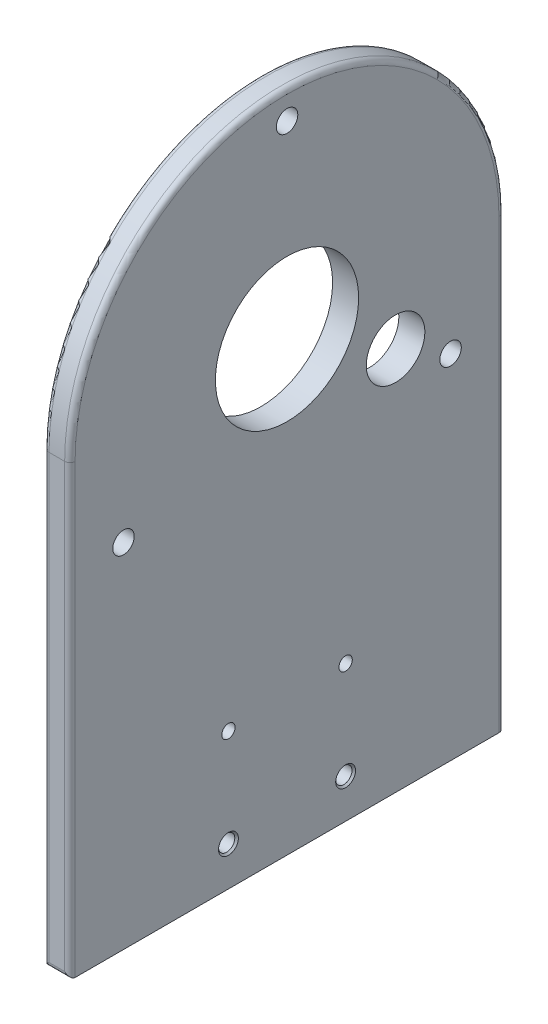
ISO-10303-21;
HEADER;
FILE_DESCRIPTION(('STEP AP214'),'2;1');
FILE_NAME('part.step','',(''),(''),'','','');
FILE_SCHEMA(('AUTOMOTIVE_DESIGN { 1 0 10303 214 1 1 1 1 }'));
ENDSEC;
DATA;
#1=APPLICATION_CONTEXT('core data for automotive mechanical design processes');
#2=APPLICATION_PROTOCOL_DEFINITION('international standard','automotive_design',2000,#1);
#3=PRODUCT_CONTEXT('',#1,'mechanical');
#4=PRODUCT('Part','Part','',(#3));
#5=PRODUCT_RELATED_PRODUCT_CATEGORY('part','',(#4));
#6=PRODUCT_DEFINITION_FORMATION('','',#4);
#7=PRODUCT_DEFINITION_CONTEXT('part definition',#1,'design');
#8=PRODUCT_DEFINITION('design','',#6,#7);
#9=PRODUCT_DEFINITION_SHAPE('','',#8);
#10=(LENGTH_UNIT() NAMED_UNIT(*) SI_UNIT(.MILLI.,.METRE.));
#11=(NAMED_UNIT(*) PLANE_ANGLE_UNIT() SI_UNIT($,.RADIAN.));
#12=(NAMED_UNIT(*) SI_UNIT($,.STERADIAN.) SOLID_ANGLE_UNIT());
#13=UNCERTAINTY_MEASURE_WITH_UNIT(LENGTH_MEASURE(1.E-05),#10,'distance_accuracy_value','');
#14=(GEOMETRIC_REPRESENTATION_CONTEXT(3) GLOBAL_UNCERTAINTY_ASSIGNED_CONTEXT((#13)) GLOBAL_UNIT_ASSIGNED_CONTEXT((#10,
#11,#12)) REPRESENTATION_CONTEXT('',''));
#15=CARTESIAN_POINT('',(0.,0.,0.));
#16=DIRECTION('',(0.,0.,1.));
#17=DIRECTION('',(1.,0.,0.));
#18=AXIS2_PLACEMENT_3D('',#15,#16,#17);
#19=CARTESIAN_POINT('',(-20.,2.,-33.35));
#20=DIRECTION('',(0.,0.,1.));
#21=DIRECTION('',(1.,0.,0.));
#22=AXIS2_PLACEMENT_3D('',#19,#20,#21);
#23=PLANE('',#22);
#24=DIRECTION('',(-1.,0.,0.));
#25=VECTOR('',#24,1.);
#26=CARTESIAN_POINT('',(20.,68.65,-33.35));
#27=LINE('',#26,#25);
#28=CARTESIAN_POINT('',(-16.8,68.65,-33.35));
#29=VERTEX_POINT('',#28);
#30=CARTESIAN_POINT('',(-19.2,68.65,-33.35));
#31=VERTEX_POINT('',#30);
#32=EDGE_CURVE('E161',#29,#31,#27,.T.);
#33=ORIENTED_EDGE('',*,*,#32,.F.);
#34=DIRECTION('',(0.,-1.,0.));
#35=VECTOR('',#34,1.);
#36=CARTESIAN_POINT('',(-16.8,2.,-33.35));
#37=LINE('',#36,#35);
#38=CARTESIAN_POINT('',(-16.8,0.,-33.35));
#39=VERTEX_POINT('',#38);
#40=EDGE_CURVE('E146',#29,#39,#37,.T.);
#41=ORIENTED_EDGE('',*,*,#40,.T.);
#42=DIRECTION('',(-1.,0.,0.));
#43=VECTOR('',#42,1.);
#44=CARTESIAN_POINT('',(-20.,0.,-33.35));
#45=LINE('',#44,#43);
#46=CARTESIAN_POINT('',(-19.2,0.,-33.35));
#47=VERTEX_POINT('',#46);
#48=EDGE_CURVE('E158',#39,#47,#45,.T.);
#49=ORIENTED_EDGE('',*,*,#48,.T.);
#50=DIRECTION('',(0.,-1.,0.));
#51=VECTOR('',#50,1.);
#52=CARTESIAN_POINT('',(-19.2,2.,-33.35));
#53=LINE('',#52,#51);
#54=EDGE_CURVE('E164',#47,#31,#53,.F.);
#55=ORIENTED_EDGE('',*,*,#54,.T.);
#56=EDGE_LOOP('',(#33,#41,#49,#55));
#57=FACE_BOUND('',#56,.T.);
#58=ADVANCED_FACE('F77',(#57),#23,.F.);
#59=CARTESIAN_POINT('',(-20.,2.,33.35));
#60=DIRECTION('',(1.,0.,0.));
#61=DIRECTION('',(0.,0.,-1.));
#62=AXIS2_PLACEMENT_3D('',#59,#60,#61);
#63=PLANE('',#62);
#64=CARTESIAN_POINT('',(-20.,21.,9.));
#65=DIRECTION('',(-1.,0.,0.));
#66=DIRECTION('',(0.,0.,1.));
#67=AXIS2_PLACEMENT_3D('',#64,#65,#66);
#68=CIRCLE('',#67,1.275);
#69=CARTESIAN_POINT('',(-20.,21.,10.275));
#70=VERTEX_POINT('',#69);
#71=EDGE_CURVE('E227',#70,#70,#68,.T.);
#72=ORIENTED_EDGE('',*,*,#71,.F.);
#73=EDGE_LOOP('',(#72));
#74=FACE_BOUND('',#73,.T.);
#75=CARTESIAN_POINT('',(-20.,21.,-9.));
#76=DIRECTION('',(-1.,0.,0.));
#77=DIRECTION('',(0.,0.,1.));
#78=AXIS2_PLACEMENT_3D('',#75,#76,#77);
#79=CIRCLE('',#78,1.275);
#80=CARTESIAN_POINT('',(-20.,21.,-7.725));
#81=VERTEX_POINT('',#80);
#82=EDGE_CURVE('E243',#81,#81,#79,.T.);
#83=ORIENTED_EDGE('',*,*,#82,.F.);
#84=EDGE_LOOP('',(#83));
#85=FACE_BOUND('',#84,.T.);
#86=CARTESIAN_POINT('',(-20.,59.0250000000002,-16.6709890228505));
#87=DIRECTION('',(1.,0.,0.));
#88=DIRECTION('',(0.,0.,-1.));
#89=AXIS2_PLACEMENT_3D('',#86,#87,#88);
#90=CIRCLE('',#89,4.49999999999999);
#91=CARTESIAN_POINT('',(-20.,59.0250000000002,-21.1709890228505));
#92=VERTEX_POINT('',#91);
#93=EDGE_CURVE('E272',#92,#92,#90,.F.);
#94=ORIENTED_EDGE('',*,*,#93,.F.);
#95=EDGE_LOOP('',(#94));
#96=FACE_BOUND('',#95,.T.);
#97=CARTESIAN_POINT('',(-20.,68.65,0.));
#98=DIRECTION('',(1.,0.,0.));
#99=DIRECTION('',(0.,0.,-1.));
#100=AXIS2_PLACEMENT_3D('',#97,#98,#99);
#101=CIRCLE('',#100,11.);
#102=CARTESIAN_POINT('',(-20.,68.65,-11.));
#103=VERTEX_POINT('',#102);
#104=EDGE_CURVE('E281',#103,#103,#101,.F.);
#105=ORIENTED_EDGE('',*,*,#104,.F.);
#106=EDGE_LOOP('',(#105));
#107=FACE_BOUND('',#106,.T.);
#108=CARTESIAN_POINT('',(-20.,97.65,0.));
#109=DIRECTION('',(-1.,0.,0.));
#110=DIRECTION('',(0.,0.,1.));
#111=AXIS2_PLACEMENT_3D('',#108,#109,#110);
#112=CIRCLE('',#111,2.025);
#113=CARTESIAN_POINT('',(-20.,97.65,2.025));
#114=VERTEX_POINT('',#113);
#115=EDGE_CURVE('E284',#114,#114,#112,.T.);
#116=ORIENTED_EDGE('',*,*,#115,.F.);
#117=EDGE_LOOP('',(#116));
#118=FACE_BOUND('',#117,.T.);
#119=CARTESIAN_POINT('',(-20.,54.1499999999999,25.1147367097487));
#120=DIRECTION('',(-1.,0.,0.));
#121=DIRECTION('',(0.,0.,1.));
#122=AXIS2_PLACEMENT_3D('',#119,#120,#121);
#123=CIRCLE('',#122,2.025);
#124=CARTESIAN_POINT('',(-20.,54.1499999999999,27.1397367097487));
#125=VERTEX_POINT('',#124);
#126=EDGE_CURVE('E190',#125,#125,#123,.T.);
#127=ORIENTED_EDGE('',*,*,#126,.F.);
#128=EDGE_LOOP('',(#127));
#129=FACE_BOUND('',#128,.T.);
#130=CARTESIAN_POINT('',(-20.,54.1500000000002,-25.1147367097489));
#131=DIRECTION('',(-1.,0.,0.));
#132=DIRECTION('',(0.,0.,1.));
#133=AXIS2_PLACEMENT_3D('',#130,#131,#132);
#134=CIRCLE('',#133,2.025);
#135=CARTESIAN_POINT('',(-20.,54.1500000000002,-23.0897367097489));
#136=VERTEX_POINT('',#135);
#137=EDGE_CURVE('E185',#136,#136,#134,.T.);
#138=ORIENTED_EDGE('',*,*,#137,.F.);
#139=EDGE_LOOP('',(#138));
#140=FACE_BOUND('',#139,.T.);
#141=CARTESIAN_POINT('',(-20.,68.65,0.));
#142=DIRECTION('',(1.,0.,0.));
#143=DIRECTION('',(0.,0.,-1.));
#144=AXIS2_PLACEMENT_3D('',#141,#142,#143);
#145=CIRCLE('',#144,32.55);
#146=CARTESIAN_POINT('',(-20.,68.65,32.55));
#147=VERTEX_POINT('',#146);
#148=CARTESIAN_POINT('',(-20.,68.65,-32.55));
#149=VERTEX_POINT('',#148);
#150=EDGE_CURVE('E205',#147,#149,#145,.F.);
#151=ORIENTED_EDGE('',*,*,#150,.T.);
#152=DIRECTION('',(0.,-1.,0.));
#153=VECTOR('',#152,1.);
#154=CARTESIAN_POINT('',(-20.,2.,-32.55));
#155=LINE('',#154,#153);
#156=CARTESIAN_POINT('',(-20.,0.,-32.55));
#157=VERTEX_POINT('',#156);
#158=EDGE_CURVE('E207',#149,#157,#155,.T.);
#159=ORIENTED_EDGE('',*,*,#158,.T.);
#160=DIRECTION('',(0.,0.,1.));
#161=VECTOR('',#160,1.);
#162=CARTESIAN_POINT('',(-20.,0.,33.35));
#163=LINE('',#162,#161);
#164=CARTESIAN_POINT('',(-20.,0.,32.55));
#165=VERTEX_POINT('',#164);
#166=EDGE_CURVE('E169',#157,#165,#163,.T.);
#167=ORIENTED_EDGE('',*,*,#166,.T.);
#168=DIRECTION('',(0.,-1.,0.));
#169=VECTOR('',#168,1.);
#170=CARTESIAN_POINT('',(-20.,2.,32.55));
#171=LINE('',#170,#169);
#172=EDGE_CURVE('E203',#165,#147,#171,.F.);
#173=ORIENTED_EDGE('',*,*,#172,.T.);
#174=EDGE_LOOP('',(#151,#159,#167,#173));
#175=FACE_BOUND('',#174,.T.);
#176=CARTESIAN_POINT('',(-20.,6.,9.));
#177=DIRECTION('',(1.,0.,0.));
#178=DIRECTION('',(0.,0.,-1.));
#179=AXIS2_PLACEMENT_3D('',#176,#177,#178);
#180=CIRCLE('',#179,1.24999999999999);
#181=CARTESIAN_POINT('',(-20.,6.,7.75000000000001));
#182=VERTEX_POINT('',#181);
#183=EDGE_CURVE('E258',#182,#182,#180,.T.);
#184=ORIENTED_EDGE('',*,*,#183,.T.);
#185=EDGE_LOOP('',(#184));
#186=FACE_BOUND('',#185,.T.);
#187=CARTESIAN_POINT('',(-20.,6.,-9.));
#188=DIRECTION('',(1.,0.,0.));
#189=DIRECTION('',(0.,0.,-1.));
#190=AXIS2_PLACEMENT_3D('',#187,#188,#189);
#191=CIRCLE('',#190,1.24999999999999);
#192=CARTESIAN_POINT('',(-20.,6.,-10.25));
#193=VERTEX_POINT('',#192);
#194=EDGE_CURVE('E267',#193,#193,#191,.T.);
#195=ORIENTED_EDGE('',*,*,#194,.T.);
#196=EDGE_LOOP('',(#195));
#197=FACE_BOUND('',#196,.T.);
#198=ADVANCED_FACE('F307',(#74,#85,#96,#107,#118,#129,#140,#175,#186,#197),#63,.F.);
#199=CARTESIAN_POINT('',(-16.,102.,-33.35));
#200=DIRECTION('',(-1.,0.,0.));
#201=DIRECTION('',(0.,0.,1.));
#202=AXIS2_PLACEMENT_3D('',#199,#200,#201);
#203=PLANE('',#202);
#204=CARTESIAN_POINT('',(-16.,21.,9.));
#205=DIRECTION('',(-1.,0.,0.));
#206=DIRECTION('',(0.,0.,1.));
#207=AXIS2_PLACEMENT_3D('',#204,#205,#206);
#208=CIRCLE('',#207,1.025);
#209=CARTESIAN_POINT('',(-16.,21.,10.025));
#210=VERTEX_POINT('',#209);
#211=EDGE_CURVE('E238',#210,#210,#208,.T.);
#212=ORIENTED_EDGE('',*,*,#211,.T.);
#213=EDGE_LOOP('',(#212));
#214=FACE_BOUND('',#213,.T.);
#215=CARTESIAN_POINT('',(-16.,21.,-9.));
#216=DIRECTION('',(-1.,0.,0.));
#217=DIRECTION('',(0.,0.,1.));
#218=AXIS2_PLACEMENT_3D('',#215,#216,#217);
#219=CIRCLE('',#218,1.025);
#220=CARTESIAN_POINT('',(-16.,21.,-7.975));
#221=VERTEX_POINT('',#220);
#222=EDGE_CURVE('E249',#221,#221,#219,.T.);
#223=ORIENTED_EDGE('',*,*,#222,.T.);
#224=EDGE_LOOP('',(#223));
#225=FACE_BOUND('',#224,.T.);
#226=CARTESIAN_POINT('',(-16.,6.,9.));
#227=DIRECTION('',(1.,0.,0.));
#228=DIRECTION('',(0.,0.,-1.));
#229=AXIS2_PLACEMENT_3D('',#226,#227,#228);
#230=CIRCLE('',#229,1.525);
#231=CARTESIAN_POINT('',(-16.,6.,7.475));
#232=VERTEX_POINT('',#231);
#233=EDGE_CURVE('E252',#232,#232,#230,.T.);
#234=ORIENTED_EDGE('',*,*,#233,.F.);
#235=EDGE_LOOP('',(#234));
#236=FACE_BOUND('',#235,.T.);
#237=CARTESIAN_POINT('',(-16.,6.,-9.));
#238=DIRECTION('',(1.,0.,0.));
#239=DIRECTION('',(0.,0.,-1.));
#240=AXIS2_PLACEMENT_3D('',#237,#238,#239);
#241=CIRCLE('',#240,1.525);
#242=CARTESIAN_POINT('',(-16.,6.,-10.525));
#243=VERTEX_POINT('',#242);
#244=EDGE_CURVE('E261',#243,#243,#241,.T.);
#245=ORIENTED_EDGE('',*,*,#244,.F.);
#246=EDGE_LOOP('',(#245));
#247=FACE_BOUND('',#246,.T.);
#248=CARTESIAN_POINT('',(-16.,59.0250000000002,-16.6709890228505));
#249=DIRECTION('',(1.,0.,0.));
#250=DIRECTION('',(0.,0.,-1.));
#251=AXIS2_PLACEMENT_3D('',#248,#249,#250);
#252=CIRCLE('',#251,4.49999999999999);
#253=CARTESIAN_POINT('',(-16.,59.0250000000002,-21.1709890228505));
#254=VERTEX_POINT('',#253);
#255=EDGE_CURVE('E275',#254,#254,#252,.T.);
#256=ORIENTED_EDGE('',*,*,#255,.F.);
#257=EDGE_LOOP('',(#256));
#258=FACE_BOUND('',#257,.T.);
#259=CARTESIAN_POINT('',(-16.,68.65,0.));
#260=DIRECTION('',(1.,0.,0.));
#261=DIRECTION('',(0.,0.,-1.));
#262=AXIS2_PLACEMENT_3D('',#259,#260,#261);
#263=CIRCLE('',#262,11.);
#264=CARTESIAN_POINT('',(-16.,68.65,-11.));
#265=VERTEX_POINT('',#264);
#266=EDGE_CURVE('E278',#265,#265,#263,.T.);
#267=ORIENTED_EDGE('',*,*,#266,.F.);
#268=EDGE_LOOP('',(#267));
#269=FACE_BOUND('',#268,.T.);
#270=CARTESIAN_POINT('',(-16.,97.65,0.));
#271=DIRECTION('',(-1.,0.,0.));
#272=DIRECTION('',(0.,0.,1.));
#273=AXIS2_PLACEMENT_3D('',#270,#271,#272);
#274=CIRCLE('',#273,1.64999999999998);
#275=CARTESIAN_POINT('',(-16.,97.65,1.64999999999998));
#276=VERTEX_POINT('',#275);
#277=EDGE_CURVE('E187',#276,#276,#274,.T.);
#278=ORIENTED_EDGE('',*,*,#277,.T.);
#279=EDGE_LOOP('',(#278));
#280=FACE_BOUND('',#279,.T.);
#281=CARTESIAN_POINT('',(-16.,54.1499999999999,25.1147367097487));
#282=DIRECTION('',(-1.,0.,0.));
#283=DIRECTION('',(0.,0.,1.));
#284=AXIS2_PLACEMENT_3D('',#281,#282,#283);
#285=CIRCLE('',#284,1.64999999999999);
#286=CARTESIAN_POINT('',(-16.,54.1499999999999,26.7647367097487));
#287=VERTEX_POINT('',#286);
#288=EDGE_CURVE('E182',#287,#287,#285,.T.);
#289=ORIENTED_EDGE('',*,*,#288,.T.);
#290=EDGE_LOOP('',(#289));
#291=FACE_BOUND('',#290,.T.);
#292=CARTESIAN_POINT('',(-16.,54.1500000000002,-25.1147367097489));
#293=DIRECTION('',(-1.,0.,0.));
#294=DIRECTION('',(0.,0.,1.));
#295=AXIS2_PLACEMENT_3D('',#292,#293,#294);
#296=CIRCLE('',#295,1.64999999999999);
#297=CARTESIAN_POINT('',(-16.,54.1500000000002,-23.4647367097489));
#298=VERTEX_POINT('',#297);
#299=EDGE_CURVE('E174',#298,#298,#296,.T.);
#300=ORIENTED_EDGE('',*,*,#299,.T.);
#301=EDGE_LOOP('',(#300));
#302=FACE_BOUND('',#301,.T.);
#303=DIRECTION('',(0.,0.,1.));
#304=VECTOR('',#303,1.);
#305=CARTESIAN_POINT('',(-16.,0.,33.35));
#306=LINE('',#305,#304);
#307=CARTESIAN_POINT('',(-16.,0.,-32.55));
#308=VERTEX_POINT('',#307);
#309=CARTESIAN_POINT('',(-16.,0.,32.55));
#310=VERTEX_POINT('',#309);
#311=EDGE_CURVE('E270',#308,#310,#306,.T.);
#312=ORIENTED_EDGE('',*,*,#311,.F.);
#313=DIRECTION('',(0.,-1.,0.));
#314=VECTOR('',#313,1.);
#315=CARTESIAN_POINT('',(-16.,102.,-32.55));
#316=LINE('',#315,#314);
#317=CARTESIAN_POINT('',(-16.,68.65,-32.55));
#318=VERTEX_POINT('',#317);
#319=EDGE_CURVE('E147',#308,#318,#316,.F.);
#320=ORIENTED_EDGE('',*,*,#319,.T.);
#321=CARTESIAN_POINT('',(-16.,68.65,0.));
#322=DIRECTION('',(-1.,0.,0.));
#323=DIRECTION('',(0.,0.,1.));
#324=AXIS2_PLACEMENT_3D('',#321,#322,#323);
#325=CIRCLE('',#324,32.55);
#326=CARTESIAN_POINT('',(-16.,68.65,32.55));
#327=VERTEX_POINT('',#326);
#328=EDGE_CURVE('E196',#318,#327,#325,.F.);
#329=ORIENTED_EDGE('',*,*,#328,.T.);
#330=DIRECTION('',(0.,-1.,0.));
#331=VECTOR('',#330,1.);
#332=CARTESIAN_POINT('',(-16.,102.,32.55));
#333=LINE('',#332,#331);
#334=EDGE_CURVE('E152',#327,#310,#333,.T.);
#335=ORIENTED_EDGE('',*,*,#334,.T.);
#336=EDGE_LOOP('',(#312,#320,#329,#335));
#337=FACE_BOUND('',#336,.T.);
#338=ADVANCED_FACE('F310',(#214,#225,#236,#247,#258,#269,#280,#291,#302,#337),#203,.F.);
#339=CARTESIAN_POINT('',(-20.,2.,33.35));
#340=DIRECTION('',(0.,0.,-1.));
#341=DIRECTION('',(-1.,0.,0.));
#342=AXIS2_PLACEMENT_3D('',#339,#340,#341);
#343=PLANE('',#342);
#344=DIRECTION('',(1.,0.,0.));
#345=VECTOR('',#344,1.);
#346=CARTESIAN_POINT('',(-16.,0.8,33.35));
#347=LINE('',#346,#345);
#348=CARTESIAN_POINT('',(-19.2,0.8,33.35));
#349=VERTEX_POINT('',#348);
#350=CARTESIAN_POINT('',(-16.8,0.8,33.35));
#351=VERTEX_POINT('',#350);
#352=EDGE_CURVE('E86',#349,#351,#347,.T.);
#353=ORIENTED_EDGE('',*,*,#352,.T.);
#354=DIRECTION('',(0.,-1.,0.));
#355=VECTOR('',#354,1.);
#356=CARTESIAN_POINT('',(-16.8,2.,33.35));
#357=LINE('',#356,#355);
#358=CARTESIAN_POINT('',(-16.8,68.65,33.35));
#359=VERTEX_POINT('',#358);
#360=EDGE_CURVE('E12',#351,#359,#357,.F.);
#361=ORIENTED_EDGE('',*,*,#360,.T.);
#362=DIRECTION('',(-1.,0.,0.));
#363=VECTOR('',#362,1.);
#364=CARTESIAN_POINT('',(20.,68.65,33.35));
#365=LINE('',#364,#363);
#366=CARTESIAN_POINT('',(-19.2,68.65,33.35));
#367=VERTEX_POINT('',#366);
#368=EDGE_CURVE('E172',#359,#367,#365,.T.);
#369=ORIENTED_EDGE('',*,*,#368,.T.);
#370=DIRECTION('',(0.,-1.,0.));
#371=VECTOR('',#370,1.);
#372=CARTESIAN_POINT('',(-19.2,2.,33.35));
#373=LINE('',#372,#371);
#374=EDGE_CURVE('E97',#367,#349,#373,.T.);
#375=ORIENTED_EDGE('',*,*,#374,.T.);
#376=EDGE_LOOP('',(#353,#361,#369,#375));
#377=FACE_BOUND('',#376,.T.);
#378=ADVANCED_FACE('F382',(#377),#343,.F.);
#379=CARTESIAN_POINT('',(0.,0.,0.));
#380=DIRECTION('',(0.,-1.,0.));
#381=DIRECTION('',(0.,0.,-1.));
#382=AXIS2_PLACEMENT_3D('',#379,#380,#381);
#383=PLANE('',#382);
#384=ORIENTED_EDGE('',*,*,#48,.F.);
#385=CARTESIAN_POINT('',(-16.8,0.,-32.55));
#386=DIRECTION('',(0.,-1.,0.));
#387=DIRECTION('',(0.,0.,-1.));
#388=AXIS2_PLACEMENT_3D('',#385,#386,#387);
#389=CIRCLE('',#388,0.8);
#390=EDGE_CURVE('E142',#39,#308,#389,.T.);
#391=ORIENTED_EDGE('',*,*,#390,.T.);
#392=ORIENTED_EDGE('',*,*,#311,.T.);
#393=DIRECTION('',(1.,0.,0.));
#394=VECTOR('',#393,1.);
#395=CARTESIAN_POINT('',(-20.,0.,32.55));
#396=LINE('',#395,#394);
#397=EDGE_CURVE('E163',#310,#165,#396,.F.);
#398=ORIENTED_EDGE('',*,*,#397,.T.);
#399=ORIENTED_EDGE('',*,*,#166,.F.);
#400=CARTESIAN_POINT('',(-19.2,0.,-32.55));
#401=DIRECTION('',(0.,-1.,0.));
#402=DIRECTION('',(0.,0.,-1.));
#403=AXIS2_PLACEMENT_3D('',#400,#401,#402);
#404=CIRCLE('',#403,0.8);
#405=EDGE_CURVE('E153',#157,#47,#404,.T.);
#406=ORIENTED_EDGE('',*,*,#405,.T.);
#407=EDGE_LOOP('',(#384,#391,#392,#398,#399,#406));
#408=FACE_BOUND('',#407,.T.);
#409=ADVANCED_FACE('F166',(#408),#383,.T.);
#410=CARTESIAN_POINT('',(20.,68.65,0.));
#411=DIRECTION('',(-1.,0.,0.));
#412=DIRECTION('',(0.,0.,1.));
#413=AXIS2_PLACEMENT_3D('',#410,#411,#412);
#414=CYLINDRICAL_SURFACE('',#413,33.35);
#415=ORIENTED_EDGE('',*,*,#368,.F.);
#416=CARTESIAN_POINT('',(-16.8,68.65,0.));
#417=DIRECTION('',(-1.,0.,0.));
#418=DIRECTION('',(0.,0.,1.));
#419=AXIS2_PLACEMENT_3D('',#416,#417,#418);
#420=CIRCLE('',#419,33.35);
#421=EDGE_CURVE('E201',#359,#29,#420,.T.);
#422=ORIENTED_EDGE('',*,*,#421,.T.);
#423=ORIENTED_EDGE('',*,*,#32,.T.);
#424=CARTESIAN_POINT('',(-19.2,68.65,0.));
#425=DIRECTION('',(1.,0.,0.));
#426=DIRECTION('',(0.,0.,-1.));
#427=AXIS2_PLACEMENT_3D('',#424,#425,#426);
#428=CIRCLE('',#427,33.35);
#429=EDGE_CURVE('E199',#31,#367,#428,.T.);
#430=ORIENTED_EDGE('',*,*,#429,.T.);
#431=EDGE_LOOP('',(#415,#422,#423,#430));
#432=FACE_BOUND('',#431,.T.);
#433=ADVANCED_FACE('F374',(#432),#414,.T.);
#434=CARTESIAN_POINT('',(-20.,54.1500000000002,-25.1147367097489));
#435=DIRECTION('',(-1.,0.,0.));
#436=DIRECTION('',(0.,0.,1.));
#437=AXIS2_PLACEMENT_3D('',#434,#435,#436);
#438=CYLINDRICAL_SURFACE('',#437,1.64999999999999);
#439=CARTESIAN_POINT('',(-19.625,54.1500000000002,-25.1147367097489));
#440=DIRECTION('',(-1.,0.,0.));
#441=DIRECTION('',(0.,0.,1.));
#442=AXIS2_PLACEMENT_3D('',#439,#440,#441);
#443=CIRCLE('',#442,1.64999999999999);
#444=CARTESIAN_POINT('',(-19.625,54.1500000000002,-23.4647367097489));
#445=VERTEX_POINT('',#444);
#446=EDGE_CURVE('E181',#445,#445,#443,.T.);
#447=ORIENTED_EDGE('',*,*,#446,.T.);
#448=EDGE_LOOP('',(#447));
#449=FACE_BOUND('',#448,.T.);
#450=ORIENTED_EDGE('',*,*,#299,.F.);
#451=EDGE_LOOP('',(#450));
#452=FACE_BOUND('',#451,.T.);
#453=ADVANCED_FACE('F297',(#449,#452),#438,.F.);
#454=CARTESIAN_POINT('',(-20.,54.1500000000002,-25.1147367097489));
#455=DIRECTION('',(-1.,0.,0.));
#456=DIRECTION('',(0.,0.,1.));
#457=AXIS2_PLACEMENT_3D('',#454,#455,#456);
#458=CONICAL_SURFACE('',#457,2.025,0.785398163397458);
#459=ORIENTED_EDGE('',*,*,#446,.F.);
#460=EDGE_LOOP('',(#459));
#461=FACE_BOUND('',#460,.T.);
#462=ORIENTED_EDGE('',*,*,#137,.T.);
#463=EDGE_LOOP('',(#462));
#464=FACE_BOUND('',#463,.T.);
#465=ADVANCED_FACE('F300',(#461,#464),#458,.F.);
#466=CARTESIAN_POINT('',(-20.,54.1499999999999,25.1147367097487));
#467=DIRECTION('',(-1.,0.,0.));
#468=DIRECTION('',(0.,0.,1.));
#469=AXIS2_PLACEMENT_3D('',#466,#467,#468);
#470=CYLINDRICAL_SURFACE('',#469,1.64999999999999);
#471=CARTESIAN_POINT('',(-19.625,54.1499999999999,25.1147367097487));
#472=DIRECTION('',(-1.,0.,0.));
#473=DIRECTION('',(0.,0.,1.));
#474=AXIS2_PLACEMENT_3D('',#471,#472,#473);
#475=CIRCLE('',#474,1.64999999999999);
#476=CARTESIAN_POINT('',(-19.625,54.1499999999999,26.7647367097487));
#477=VERTEX_POINT('',#476);
#478=EDGE_CURVE('E186',#477,#477,#475,.T.);
#479=ORIENTED_EDGE('',*,*,#478,.T.);
#480=EDGE_LOOP('',(#479));
#481=FACE_BOUND('',#480,.T.);
#482=ORIENTED_EDGE('',*,*,#288,.F.);
#483=EDGE_LOOP('',(#482));
#484=FACE_BOUND('',#483,.T.);
#485=ADVANCED_FACE('F303',(#481,#484),#470,.F.);
#486=CARTESIAN_POINT('',(-20.,54.1499999999999,25.1147367097487));
#487=DIRECTION('',(-1.,0.,0.));
#488=DIRECTION('',(0.,0.,1.));
#489=AXIS2_PLACEMENT_3D('',#486,#487,#488);
#490=CONICAL_SURFACE('',#489,2.025,0.785398163397458);
#491=ORIENTED_EDGE('',*,*,#478,.F.);
#492=EDGE_LOOP('',(#491));
#493=FACE_BOUND('',#492,.T.);
#494=ORIENTED_EDGE('',*,*,#126,.T.);
#495=EDGE_LOOP('',(#494));
#496=FACE_BOUND('',#495,.T.);
#497=ADVANCED_FACE('F397',(#493,#496),#490,.F.);
#498=CARTESIAN_POINT('',(-20.,97.65,0.));
#499=DIRECTION('',(-1.,0.,0.));
#500=DIRECTION('',(0.,0.,1.));
#501=AXIS2_PLACEMENT_3D('',#498,#499,#500);
#502=CYLINDRICAL_SURFACE('',#501,1.64999999999998);
#503=CARTESIAN_POINT('',(-19.625,97.65,0.));
#504=DIRECTION('',(-1.,0.,0.));
#505=DIRECTION('',(0.,0.,1.));
#506=AXIS2_PLACEMENT_3D('',#503,#504,#505);
#507=CIRCLE('',#506,1.64999999999998);
#508=CARTESIAN_POINT('',(-19.625,97.65,1.64999999999998));
#509=VERTEX_POINT('',#508);
#510=EDGE_CURVE('E191',#509,#509,#507,.T.);
#511=ORIENTED_EDGE('',*,*,#510,.T.);
#512=EDGE_LOOP('',(#511));
#513=FACE_BOUND('',#512,.T.);
#514=ORIENTED_EDGE('',*,*,#277,.F.);
#515=EDGE_LOOP('',(#514));
#516=FACE_BOUND('',#515,.T.);
#517=ADVANCED_FACE('F401',(#513,#516),#502,.F.);
#518=CARTESIAN_POINT('',(-20.,97.65,0.));
#519=DIRECTION('',(-1.,0.,0.));
#520=DIRECTION('',(0.,0.,1.));
#521=AXIS2_PLACEMENT_3D('',#518,#519,#520);
#522=CONICAL_SURFACE('',#521,2.025,0.785398163397467);
#523=ORIENTED_EDGE('',*,*,#510,.F.);
#524=EDGE_LOOP('',(#523));
#525=FACE_BOUND('',#524,.T.);
#526=ORIENTED_EDGE('',*,*,#115,.T.);
#527=EDGE_LOOP('',(#526));
#528=FACE_BOUND('',#527,.T.);
#529=ADVANCED_FACE('F405',(#525,#528),#522,.F.);
#530=CARTESIAN_POINT('',(-160.001,68.65,0.));
#531=DIRECTION('',(1.,0.,0.));
#532=DIRECTION('',(0.,0.,-1.));
#533=AXIS2_PLACEMENT_3D('',#530,#531,#532);
#534=CYLINDRICAL_SURFACE('',#533,11.);
#535=ORIENTED_EDGE('',*,*,#266,.T.);
#536=EDGE_LOOP('',(#535));
#537=FACE_BOUND('',#536,.T.);
#538=ORIENTED_EDGE('',*,*,#104,.T.);
#539=EDGE_LOOP('',(#538));
#540=FACE_BOUND('',#539,.T.);
#541=ADVANCED_FACE('F409',(#537,#540),#534,.F.);
#542=CARTESIAN_POINT('',(-160.001,59.0250000000002,-16.6709890228505));
#543=DIRECTION('',(1.,0.,0.));
#544=DIRECTION('',(0.,0.,-1.));
#545=AXIS2_PLACEMENT_3D('',#542,#543,#544);
#546=CYLINDRICAL_SURFACE('',#545,4.49999999999999);
#547=ORIENTED_EDGE('',*,*,#255,.T.);
#548=EDGE_LOOP('',(#547));
#549=FACE_BOUND('',#548,.T.);
#550=ORIENTED_EDGE('',*,*,#93,.T.);
#551=EDGE_LOOP('',(#550));
#552=FACE_BOUND('',#551,.T.);
#553=ADVANCED_FACE('F332',(#549,#552),#546,.F.);
#554=CARTESIAN_POINT('',(-16.,6.,-9.));
#555=DIRECTION('',(1.,0.,0.));
#556=DIRECTION('',(0.,0.,-1.));
#557=AXIS2_PLACEMENT_3D('',#554,#555,#556);
#558=CONICAL_SURFACE('',#557,1.525,0.785398163397445);
#559=CARTESIAN_POINT('',(-16.275,6.,-9.));
#560=DIRECTION('',(1.,0.,0.));
#561=DIRECTION('',(0.,0.,-1.));
#562=AXIS2_PLACEMENT_3D('',#559,#560,#561);
#563=CIRCLE('',#562,1.24999999999999);
#564=CARTESIAN_POINT('',(-16.275,6.,-10.25));
#565=VERTEX_POINT('',#564);
#566=EDGE_CURVE('E264',#565,#565,#563,.T.);
#567=ORIENTED_EDGE('',*,*,#566,.F.);
#568=EDGE_LOOP('',(#567));
#569=FACE_BOUND('',#568,.T.);
#570=ORIENTED_EDGE('',*,*,#244,.T.);
#571=EDGE_LOOP('',(#570));
#572=FACE_BOUND('',#571,.T.);
#573=ADVANCED_FACE('F322',(#569,#572),#558,.F.);
#574=CARTESIAN_POINT('',(-16.,6.,-9.));
#575=DIRECTION('',(1.,0.,0.));
#576=DIRECTION('',(0.,0.,-1.));
#577=AXIS2_PLACEMENT_3D('',#574,#575,#576);
#578=CYLINDRICAL_SURFACE('',#577,1.24999999999999);
#579=ORIENTED_EDGE('',*,*,#566,.T.);
#580=EDGE_LOOP('',(#579));
#581=FACE_BOUND('',#580,.T.);
#582=ORIENTED_EDGE('',*,*,#194,.F.);
#583=EDGE_LOOP('',(#582));
#584=FACE_BOUND('',#583,.T.);
#585=ADVANCED_FACE('F319',(#581,#584),#578,.F.);
#586=CARTESIAN_POINT('',(-16.,6.,9.));
#587=DIRECTION('',(1.,0.,0.));
#588=DIRECTION('',(0.,0.,-1.));
#589=AXIS2_PLACEMENT_3D('',#586,#587,#588);
#590=CYLINDRICAL_SURFACE('',#589,1.24999999999999);
#591=CARTESIAN_POINT('',(-16.275,6.,9.));
#592=DIRECTION('',(1.,0.,0.));
#593=DIRECTION('',(0.,0.,-1.));
#594=AXIS2_PLACEMENT_3D('',#591,#592,#593);
#595=CIRCLE('',#594,1.24999999999999);
#596=CARTESIAN_POINT('',(-16.275,6.,7.75000000000001));
#597=VERTEX_POINT('',#596);
#598=EDGE_CURVE('E255',#597,#597,#595,.T.);
#599=ORIENTED_EDGE('',*,*,#598,.T.);
#600=EDGE_LOOP('',(#599));
#601=FACE_BOUND('',#600,.T.);
#602=ORIENTED_EDGE('',*,*,#183,.F.);
#603=EDGE_LOOP('',(#602));
#604=FACE_BOUND('',#603,.T.);
#605=ADVANCED_FACE('F321',(#601,#604),#590,.F.);
#606=CARTESIAN_POINT('',(-16.,6.,9.));
#607=DIRECTION('',(1.,0.,0.));
#608=DIRECTION('',(0.,0.,-1.));
#609=AXIS2_PLACEMENT_3D('',#606,#607,#608);
#610=CONICAL_SURFACE('',#609,1.525,0.785398163397445);
#611=ORIENTED_EDGE('',*,*,#598,.F.);
#612=EDGE_LOOP('',(#611));
#613=FACE_BOUND('',#612,.T.);
#614=ORIENTED_EDGE('',*,*,#233,.T.);
#615=EDGE_LOOP('',(#614));
#616=FACE_BOUND('',#615,.T.);
#617=ADVANCED_FACE('F328',(#613,#616),#610,.F.);
#618=CARTESIAN_POINT('',(-20.,21.,-9.));
#619=DIRECTION('',(-1.,0.,0.));
#620=DIRECTION('',(0.,0.,1.));
#621=AXIS2_PLACEMENT_3D('',#618,#619,#620);
#622=CYLINDRICAL_SURFACE('',#621,1.025);
#623=ORIENTED_EDGE('',*,*,#222,.F.);
#624=EDGE_LOOP('',(#623));
#625=FACE_BOUND('',#624,.T.);
#626=CARTESIAN_POINT('',(-19.75,21.,-9.));
#627=DIRECTION('',(-1.,0.,0.));
#628=DIRECTION('',(0.,0.,1.));
#629=AXIS2_PLACEMENT_3D('',#626,#627,#628);
#630=CIRCLE('',#629,1.025);
#631=CARTESIAN_POINT('',(-19.75,21.,-7.975));
#632=VERTEX_POINT('',#631);
#633=EDGE_CURVE('E246',#632,#632,#630,.T.);
#634=ORIENTED_EDGE('',*,*,#633,.T.);
#635=EDGE_LOOP('',(#634));
#636=FACE_BOUND('',#635,.T.);
#637=ADVANCED_FACE('F468',(#625,#636),#622,.F.);
#638=CARTESIAN_POINT('',(-20.,21.,-9.));
#639=DIRECTION('',(-1.,0.,0.));
#640=DIRECTION('',(0.,0.,1.));
#641=AXIS2_PLACEMENT_3D('',#638,#639,#640);
#642=CONICAL_SURFACE('',#641,1.275,0.785398163397448);
#643=ORIENTED_EDGE('',*,*,#633,.F.);
#644=EDGE_LOOP('',(#643));
#645=FACE_BOUND('',#644,.T.);
#646=ORIENTED_EDGE('',*,*,#82,.T.);
#647=EDGE_LOOP('',(#646));
#648=FACE_BOUND('',#647,.T.);
#649=ADVANCED_FACE('F478',(#645,#648),#642,.F.);
#650=CARTESIAN_POINT('',(-20.,21.,9.));
#651=DIRECTION('',(-1.,0.,0.));
#652=DIRECTION('',(0.,0.,1.));
#653=AXIS2_PLACEMENT_3D('',#650,#651,#652);
#654=CYLINDRICAL_SURFACE('',#653,1.025);
#655=ORIENTED_EDGE('',*,*,#211,.F.);
#656=EDGE_LOOP('',(#655));
#657=FACE_BOUND('',#656,.T.);
#658=CARTESIAN_POINT('',(-19.75,21.,9.));
#659=DIRECTION('',(-1.,0.,0.));
#660=DIRECTION('',(0.,0.,1.));
#661=AXIS2_PLACEMENT_3D('',#658,#659,#660);
#662=CIRCLE('',#661,1.025);
#663=CARTESIAN_POINT('',(-19.75,21.,10.025));
#664=VERTEX_POINT('',#663);
#665=EDGE_CURVE('E233',#664,#664,#662,.T.);
#666=ORIENTED_EDGE('',*,*,#665,.T.);
#667=EDGE_LOOP('',(#666));
#668=FACE_BOUND('',#667,.T.);
#669=ADVANCED_FACE('F369',(#657,#668),#654,.F.);
#670=CARTESIAN_POINT('',(-20.,21.,9.));
#671=DIRECTION('',(-1.,0.,0.));
#672=DIRECTION('',(0.,0.,1.));
#673=AXIS2_PLACEMENT_3D('',#670,#671,#672);
#674=CONICAL_SURFACE('',#673,1.275,0.785398163397448);
#675=ORIENTED_EDGE('',*,*,#665,.F.);
#676=EDGE_LOOP('',(#675));
#677=FACE_BOUND('',#676,.T.);
#678=ORIENTED_EDGE('',*,*,#71,.T.);
#679=EDGE_LOOP('',(#678));
#680=FACE_BOUND('',#679,.T.);
#681=ADVANCED_FACE('F364',(#677,#680),#674,.F.);
#682=CARTESIAN_POINT('',(-19.2,2.,-32.55));
#683=DIRECTION('',(0.,-1.,0.));
#684=DIRECTION('',(0.,0.,-1.));
#685=AXIS2_PLACEMENT_3D('',#682,#683,#684);
#686=CYLINDRICAL_SURFACE('',#685,0.8);
#687=ORIENTED_EDGE('',*,*,#405,.F.);
#688=ORIENTED_EDGE('',*,*,#158,.F.);
#689=CARTESIAN_POINT('',(-19.2,68.65,-32.55));
#690=DIRECTION('',(0.,1.,0.));
#691=DIRECTION('',(0.,0.,1.));
#692=AXIS2_PLACEMENT_3D('',#689,#690,#691);
#693=CIRCLE('',#692,0.8);
#694=EDGE_CURVE('E81',#31,#149,#693,.T.);
#695=ORIENTED_EDGE('',*,*,#694,.F.);
#696=ORIENTED_EDGE('',*,*,#54,.F.);
#697=EDGE_LOOP('',(#687,#688,#695,#696));
#698=FACE_BOUND('',#697,.T.);
#699=ADVANCED_FACE('F79',(#698),#686,.T.);
#700=CARTESIAN_POINT('',(-19.2,68.65,0.));
#701=DIRECTION('',(1.,0.,0.));
#702=DIRECTION('',(0.,0.,-1.));
#703=AXIS2_PLACEMENT_3D('',#700,#701,#702);
#704=TOROIDAL_SURFACE('',#703,32.55,0.8);
#705=ORIENTED_EDGE('',*,*,#694,.T.);
#706=ORIENTED_EDGE('',*,*,#150,.F.);
#707=CARTESIAN_POINT('',(-19.2,68.65,32.55));
#708=DIRECTION('',(0.,-1.,0.));
#709=DIRECTION('',(0.,0.,-1.));
#710=AXIS2_PLACEMENT_3D('',#707,#708,#709);
#711=CIRCLE('',#710,0.8);
#712=EDGE_CURVE('E221',#367,#147,#711,.T.);
#713=ORIENTED_EDGE('',*,*,#712,.F.);
#714=ORIENTED_EDGE('',*,*,#429,.F.);
#715=EDGE_LOOP('',(#705,#706,#713,#714));
#716=FACE_BOUND('',#715,.T.);
#717=ADVANCED_FACE('F359',(#716),#704,.T.);
#718=CARTESIAN_POINT('',(-19.2,2.,32.55));
#719=DIRECTION('',(0.,-1.,0.));
#720=DIRECTION('',(0.,0.,-1.));
#721=AXIS2_PLACEMENT_3D('',#718,#719,#720);
#722=CYLINDRICAL_SURFACE('',#721,0.8);
#723=ORIENTED_EDGE('',*,*,#712,.T.);
#724=ORIENTED_EDGE('',*,*,#172,.F.);
#725=CARTESIAN_POINT('',(-19.2,0.8,32.55));
#726=DIRECTION('',(0.707106781186547,-0.707106781186547,0.));
#727=DIRECTION('',(-0.707106781186547,-0.707106781186547,0.));
#728=AXIS2_PLACEMENT_3D('',#725,#726,#727);
#729=ELLIPSE('',#728,1.13137084989848,0.8);
#730=EDGE_CURVE('E219',#349,#165,#729,.T.);
#731=ORIENTED_EDGE('',*,*,#730,.F.);
#732=ORIENTED_EDGE('',*,*,#374,.F.);
#733=EDGE_LOOP('',(#723,#724,#731,#732));
#734=FACE_BOUND('',#733,.T.);
#735=ADVANCED_FACE('F356',(#734),#722,.T.);
#736=CARTESIAN_POINT('',(-20.,0.8,32.55));
#737=DIRECTION('',(-1.,0.,0.));
#738=DIRECTION('',(0.,0.,1.));
#739=AXIS2_PLACEMENT_3D('',#736,#737,#738);
#740=CYLINDRICAL_SURFACE('',#739,0.8);
#741=ORIENTED_EDGE('',*,*,#730,.T.);
#742=ORIENTED_EDGE('',*,*,#397,.F.);
#743=CARTESIAN_POINT('',(-16.8,0.799999999999997,32.55));
#744=DIRECTION('',(-0.707106781186547,-0.707106781186547,0.));
#745=DIRECTION('',(-0.707106781186547,0.707106781186547,0.));
#746=AXIS2_PLACEMENT_3D('',#743,#744,#745);
#747=ELLIPSE('',#746,1.13137084989848,0.8);
#748=EDGE_CURVE('E216',#351,#310,#747,.F.);
#749=ORIENTED_EDGE('',*,*,#748,.F.);
#750=ORIENTED_EDGE('',*,*,#352,.F.);
#751=EDGE_LOOP('',(#741,#742,#749,#750));
#752=FACE_BOUND('',#751,.T.);
#753=ADVANCED_FACE('F352',(#752),#740,.T.);
#754=CARTESIAN_POINT('',(-16.8,102.,32.55));
#755=DIRECTION('',(0.,-1.,0.));
#756=DIRECTION('',(0.,0.,-1.));
#757=AXIS2_PLACEMENT_3D('',#754,#755,#756);
#758=CYLINDRICAL_SURFACE('',#757,0.8);
#759=ORIENTED_EDGE('',*,*,#748,.T.);
#760=ORIENTED_EDGE('',*,*,#334,.F.);
#761=CARTESIAN_POINT('',(-16.8,68.65,32.55));
#762=DIRECTION('',(0.,1.,0.));
#763=DIRECTION('',(0.,0.,1.));
#764=AXIS2_PLACEMENT_3D('',#761,#762,#763);
#765=CIRCLE('',#764,0.8);
#766=EDGE_CURVE('E213',#359,#327,#765,.T.);
#767=ORIENTED_EDGE('',*,*,#766,.F.);
#768=ORIENTED_EDGE('',*,*,#360,.F.);
#769=EDGE_LOOP('',(#759,#760,#767,#768));
#770=FACE_BOUND('',#769,.T.);
#771=ADVANCED_FACE('F348',(#770),#758,.T.);
#772=CARTESIAN_POINT('',(-16.8,68.65,0.));
#773=DIRECTION('',(-1.,0.,0.));
#774=DIRECTION('',(0.,0.,1.));
#775=AXIS2_PLACEMENT_3D('',#772,#773,#774);
#776=TOROIDAL_SURFACE('',#775,32.55,0.8);
#777=ORIENTED_EDGE('',*,*,#766,.T.);
#778=ORIENTED_EDGE('',*,*,#328,.F.);
#779=CARTESIAN_POINT('',(-16.8,68.65,-32.55));
#780=DIRECTION('',(0.,-1.,0.));
#781=DIRECTION('',(0.,0.,-1.));
#782=AXIS2_PLACEMENT_3D('',#779,#780,#781);
#783=CIRCLE('',#782,0.8);
#784=EDGE_CURVE('E211',#29,#318,#783,.T.);
#785=ORIENTED_EDGE('',*,*,#784,.F.);
#786=ORIENTED_EDGE('',*,*,#421,.F.);
#787=EDGE_LOOP('',(#777,#778,#785,#786));
#788=FACE_BOUND('',#787,.T.);
#789=ADVANCED_FACE('F345',(#788),#776,.T.);
#790=CARTESIAN_POINT('',(-16.8,2.,-32.55));
#791=DIRECTION('',(0.,-1.,0.));
#792=DIRECTION('',(0.,0.,-1.));
#793=AXIS2_PLACEMENT_3D('',#790,#791,#792);
#794=CYLINDRICAL_SURFACE('',#793,0.8);
#795=ORIENTED_EDGE('',*,*,#784,.T.);
#796=ORIENTED_EDGE('',*,*,#319,.F.);
#797=ORIENTED_EDGE('',*,*,#390,.F.);
#798=ORIENTED_EDGE('',*,*,#40,.F.);
#799=EDGE_LOOP('',(#795,#796,#797,#798));
#800=FACE_BOUND('',#799,.T.);
#801=ADVANCED_FACE('F145',(#800),#794,.T.);
#802=CLOSED_SHELL('',(#58,#198,#338,#378,#409,#433,#453,#465,#485,#497,#517,#529,#541,#553,#573,
#585,#605,#617,#637,#649,#669,#681,#699,#717,#735,#753,#771,#789,#801));
#803=MANIFOLD_SOLID_BREP('B2',#802);
#804=ADVANCED_BREP_SHAPE_REPRESENTATION('',(#18,#803),#14);
#805=SHAPE_DEFINITION_REPRESENTATION(#9,#804);
ENDSEC;
END-ISO-10303-21;
